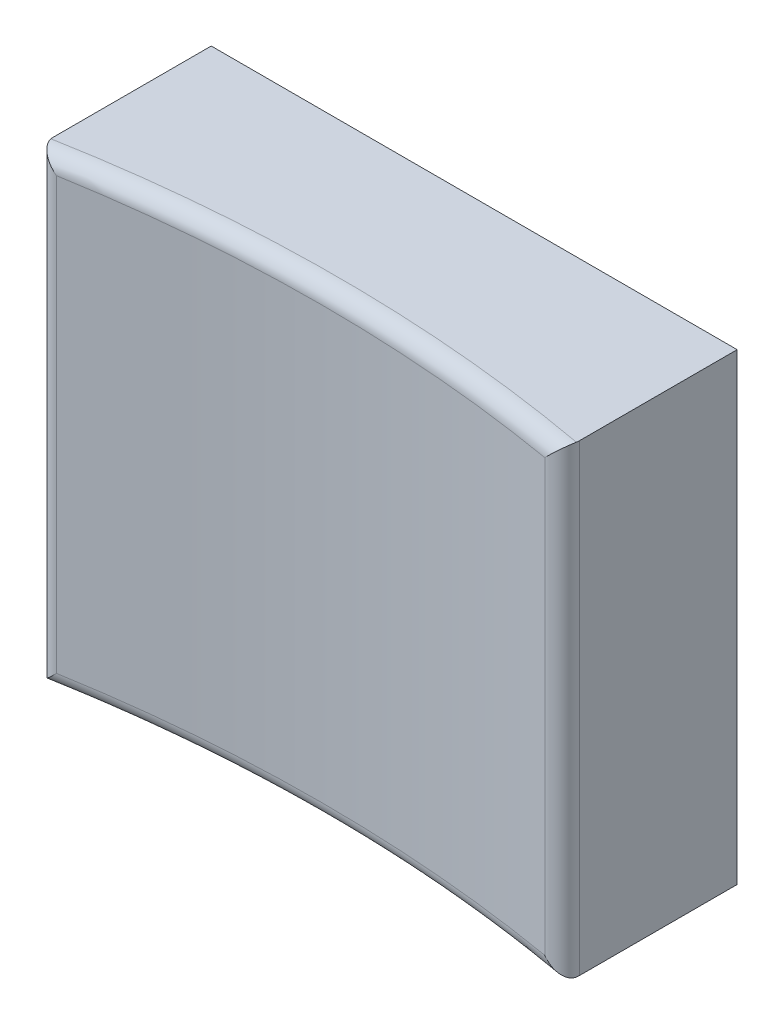
ISO-10303-21;
HEADER;
FILE_DESCRIPTION(('STEP AP214'),'2;1');
FILE_NAME('part.step','',(''),(''),'','','');
FILE_SCHEMA(('AUTOMOTIVE_DESIGN { 1 0 10303 214 1 1 1 1 }'));
ENDSEC;
DATA;
#1=APPLICATION_CONTEXT('core data for automotive mechanical design processes');
#2=APPLICATION_PROTOCOL_DEFINITION('international standard','automotive_design',2000,#1);
#3=PRODUCT_CONTEXT('',#1,'mechanical');
#4=PRODUCT('Part','Part','',(#3));
#5=PRODUCT_RELATED_PRODUCT_CATEGORY('part','',(#4));
#6=PRODUCT_DEFINITION_FORMATION('','',#4);
#7=PRODUCT_DEFINITION_CONTEXT('part definition',#1,'design');
#8=PRODUCT_DEFINITION('design','',#6,#7);
#9=PRODUCT_DEFINITION_SHAPE('','',#8);
#10=(LENGTH_UNIT() NAMED_UNIT(*) SI_UNIT(.MILLI.,.METRE.));
#11=(NAMED_UNIT(*) PLANE_ANGLE_UNIT() SI_UNIT($,.RADIAN.));
#12=(NAMED_UNIT(*) SI_UNIT($,.STERADIAN.) SOLID_ANGLE_UNIT());
#13=UNCERTAINTY_MEASURE_WITH_UNIT(LENGTH_MEASURE(1.E-05),#10,'distance_accuracy_value','');
#14=(GEOMETRIC_REPRESENTATION_CONTEXT(3) GLOBAL_UNCERTAINTY_ASSIGNED_CONTEXT((#13)) GLOBAL_UNIT_ASSIGNED_CONTEXT((#10,
#11,#12)) REPRESENTATION_CONTEXT('',''));
#15=CARTESIAN_POINT('',(0.,0.,0.));
#16=DIRECTION('',(0.,0.,1.));
#17=DIRECTION('',(1.,0.,0.));
#18=AXIS2_PLACEMENT_3D('',#15,#16,#17);
#19=CARTESIAN_POINT('',(-4.1529,3.6576,2.794));
#20=DIRECTION('',(1.,0.,0.));
#21=DIRECTION('',(0.,0.,-1.));
#22=AXIS2_PLACEMENT_3D('',#19,#20,#21);
#23=PLANE('',#22);
#24=DIRECTION('',(0.,0.,-1.));
#25=VECTOR('',#24,1.);
#26=CARTESIAN_POINT('',(-4.1529,-3.6576,2.794));
#27=LINE('',#26,#25);
#28=CARTESIAN_POINT('',(-4.1529,-3.6576,2.49082226780297));
#29=VERTEX_POINT('',#28);
#30=CARTESIAN_POINT('',(-4.1529,-3.6576,0.));
#31=VERTEX_POINT('',#30);
#32=EDGE_CURVE('E101',#29,#31,#27,.T.);
#33=ORIENTED_EDGE('',*,*,#32,.F.);
#34=DIRECTION('',(0.,-1.,0.));
#35=VECTOR('',#34,1.);
#36=CARTESIAN_POINT('',(-4.1529,3.6576,2.49082226780297));
#37=LINE('',#36,#35);
#38=CARTESIAN_POINT('',(-4.1529,3.6576,2.49082226780297));
#39=VERTEX_POINT('',#38);
#40=EDGE_CURVE('E11',#29,#39,#37,.F.);
#41=ORIENTED_EDGE('',*,*,#40,.T.);
#42=DIRECTION('',(0.,0.,-1.));
#43=VECTOR('',#42,1.);
#44=CARTESIAN_POINT('',(-4.1529,3.6576,2.794));
#45=LINE('',#44,#43);
#46=CARTESIAN_POINT('',(-4.1529,3.6576,0.));
#47=VERTEX_POINT('',#46);
#48=EDGE_CURVE('E124',#39,#47,#45,.T.);
#49=ORIENTED_EDGE('',*,*,#48,.T.);
#50=DIRECTION('',(0.,-1.,0.));
#51=VECTOR('',#50,1.);
#52=CARTESIAN_POINT('',(-4.1529,3.6576,0.));
#53=LINE('',#52,#51);
#54=EDGE_CURVE('E120',#47,#31,#53,.T.);
#55=ORIENTED_EDGE('',*,*,#54,.T.);
#56=EDGE_LOOP('',(#33,#41,#49,#55));
#57=FACE_BOUND('',#56,.T.);
#58=ADVANCED_FACE('F32',(#57),#23,.F.);
#59=CARTESIAN_POINT('',(-4.1529,-3.6576,2.794));
#60=DIRECTION('',(0.,1.,0.));
#61=DIRECTION('',(0.,0.,1.));
#62=AXIS2_PLACEMENT_3D('',#59,#60,#61);
#63=PLANE('',#62);
#64=DIRECTION('',(0.,0.,-1.));
#65=VECTOR('',#64,1.);
#66=CARTESIAN_POINT('',(4.1529,-3.6576,2.794));
#67=LINE('',#66,#65);
#68=CARTESIAN_POINT('',(4.1529,-3.6576,2.49082226780297));
#69=VERTEX_POINT('',#68);
#70=CARTESIAN_POINT('',(4.1529,-3.6576,0.));
#71=VERTEX_POINT('',#70);
#72=EDGE_CURVE('E114',#69,#71,#67,.T.);
#73=ORIENTED_EDGE('',*,*,#72,.F.);
#74=CARTESIAN_POINT('',(3.8989,-3.6576,2.49082226780297));
#75=DIRECTION('',(0.,1.,0.));
#76=DIRECTION('',(0.,0.,1.));
#77=AXIS2_PLACEMENT_3D('',#74,#75,#76);
#78=CIRCLE('',#77,0.254);
#79=CARTESIAN_POINT('',(4.14902115128335,-3.6576,2.53504228228519));
#80=VERTEX_POINT('',#79);
#81=EDGE_CURVE('E148',#69,#80,#78,.F.);
#82=ORIENTED_EDGE('',*,*,#81,.T.);
#83=CARTESIAN_POINT('',(0.,-3.6576,25.2736134662053));
#84=DIRECTION('',(0.,1.,0.));
#85=DIRECTION('',(0.,0.,1.));
#86=AXIS2_PLACEMENT_3D('',#83,#84,#85);
#87=CIRCLE('',#86,23.114);
#88=CARTESIAN_POINT('',(-4.14902115128334,-3.6576,2.53504228228519));
#89=VERTEX_POINT('',#88);
#90=EDGE_CURVE('E146',#80,#89,#87,.T.);
#91=ORIENTED_EDGE('',*,*,#90,.T.);
#92=CARTESIAN_POINT('',(-3.8989,-3.6576,2.49082226780297));
#93=DIRECTION('',(0.,1.,0.));
#94=DIRECTION('',(0.,0.,1.));
#95=AXIS2_PLACEMENT_3D('',#92,#93,#94);
#96=CIRCLE('',#95,0.254);
#97=EDGE_CURVE('E109',#89,#29,#96,.F.);
#98=ORIENTED_EDGE('',*,*,#97,.T.);
#99=ORIENTED_EDGE('',*,*,#32,.T.);
#100=DIRECTION('',(1.,0.,0.));
#101=VECTOR('',#100,1.);
#102=CARTESIAN_POINT('',(-4.1529,-3.6576,0.));
#103=LINE('',#102,#101);
#104=EDGE_CURVE('E105',#31,#71,#103,.T.);
#105=ORIENTED_EDGE('',*,*,#104,.T.);
#106=EDGE_LOOP('',(#73,#82,#91,#98,#99,#105));
#107=FACE_BOUND('',#106,.T.);
#108=ADVANCED_FACE('F104',(#107),#63,.F.);
#109=CARTESIAN_POINT('',(4.1529,3.6576,2.794));
#110=DIRECTION('',(-1.,0.,0.));
#111=DIRECTION('',(0.,0.,1.));
#112=AXIS2_PLACEMENT_3D('',#109,#110,#111);
#113=PLANE('',#112);
#114=DIRECTION('',(0.,0.,-1.));
#115=VECTOR('',#114,1.);
#116=CARTESIAN_POINT('',(4.1529,3.6576,2.794));
#117=LINE('',#116,#115);
#118=CARTESIAN_POINT('',(4.1529,3.6576,2.49082226780297));
#119=VERTEX_POINT('',#118);
#120=CARTESIAN_POINT('',(4.1529,3.6576,0.));
#121=VERTEX_POINT('',#120);
#122=EDGE_CURVE('E134',#119,#121,#117,.T.);
#123=ORIENTED_EDGE('',*,*,#122,.F.);
#124=DIRECTION('',(0.,-1.,0.));
#125=VECTOR('',#124,1.);
#126=CARTESIAN_POINT('',(4.1529,3.6576,2.49082226780297));
#127=LINE('',#126,#125);
#128=EDGE_CURVE('E45',#119,#69,#127,.T.);
#129=ORIENTED_EDGE('',*,*,#128,.T.);
#130=ORIENTED_EDGE('',*,*,#72,.T.);
#131=DIRECTION('',(0.,1.,0.));
#132=VECTOR('',#131,1.);
#133=CARTESIAN_POINT('',(4.1529,3.6576,0.));
#134=LINE('',#133,#132);
#135=EDGE_CURVE('E122',#71,#121,#134,.T.);
#136=ORIENTED_EDGE('',*,*,#135,.T.);
#137=EDGE_LOOP('',(#123,#129,#130,#136));
#138=FACE_BOUND('',#137,.T.);
#139=ADVANCED_FACE('F199',(#138),#113,.F.);
#140=CARTESIAN_POINT('',(-4.1529,3.6576,2.794));
#141=DIRECTION('',(0.,-1.,0.));
#142=DIRECTION('',(0.,0.,-1.));
#143=AXIS2_PLACEMENT_3D('',#140,#141,#142);
#144=PLANE('',#143);
#145=CARTESIAN_POINT('',(0.,3.6576,25.2736134662053));
#146=DIRECTION('',(0.,-1.,0.));
#147=DIRECTION('',(0.,0.,-1.));
#148=AXIS2_PLACEMENT_3D('',#145,#146,#147);
#149=CIRCLE('',#148,23.114);
#150=CARTESIAN_POINT('',(-4.14902115128334,3.6576,2.53504228228519));
#151=VERTEX_POINT('',#150);
#152=CARTESIAN_POINT('',(4.14902115128335,3.6576,2.53504228228519));
#153=VERTEX_POINT('',#152);
#154=EDGE_CURVE('E53',#151,#153,#149,.T.);
#155=ORIENTED_EDGE('',*,*,#154,.T.);
#156=CARTESIAN_POINT('',(3.8989,3.6576,2.49082226780297));
#157=DIRECTION('',(0.,-1.,0.));
#158=DIRECTION('',(0.,0.,-1.));
#159=AXIS2_PLACEMENT_3D('',#156,#157,#158);
#160=CIRCLE('',#159,0.254);
#161=EDGE_CURVE('E152',#153,#119,#160,.F.);
#162=ORIENTED_EDGE('',*,*,#161,.T.);
#163=ORIENTED_EDGE('',*,*,#122,.T.);
#164=DIRECTION('',(-1.,0.,0.));
#165=VECTOR('',#164,1.);
#166=CARTESIAN_POINT('',(-4.1529,3.6576,0.));
#167=LINE('',#166,#165);
#168=EDGE_CURVE('E131',#121,#47,#167,.T.);
#169=ORIENTED_EDGE('',*,*,#168,.T.);
#170=ORIENTED_EDGE('',*,*,#48,.F.);
#171=CARTESIAN_POINT('',(-3.8989,3.6576,2.49082226780297));
#172=DIRECTION('',(0.,-1.,0.));
#173=DIRECTION('',(0.,0.,-1.));
#174=AXIS2_PLACEMENT_3D('',#171,#172,#173);
#175=CIRCLE('',#174,0.254);
#176=EDGE_CURVE('E58',#39,#151,#175,.F.);
#177=ORIENTED_EDGE('',*,*,#176,.T.);
#178=EDGE_LOOP('',(#155,#162,#163,#169,#170,#177));
#179=FACE_BOUND('',#178,.T.);
#180=ADVANCED_FACE('F197',(#179),#144,.F.);
#181=CARTESIAN_POINT('',(-4.1529,-3.6576,0.));
#182=DIRECTION('',(0.,0.,1.));
#183=DIRECTION('',(1.,0.,0.));
#184=AXIS2_PLACEMENT_3D('',#181,#182,#183);
#185=PLANE('',#184);
#186=ORIENTED_EDGE('',*,*,#54,.F.);
#187=ORIENTED_EDGE('',*,*,#168,.F.);
#188=ORIENTED_EDGE('',*,*,#135,.F.);
#189=ORIENTED_EDGE('',*,*,#104,.F.);
#190=EDGE_LOOP('',(#186,#187,#188,#189));
#191=FACE_BOUND('',#190,.T.);
#192=ADVANCED_FACE('F118',(#191),#185,.F.);
#193=CARTESIAN_POINT('',(0.,3.6576,25.2736134662053));
#194=DIRECTION('',(0.,-1.,0.));
#195=DIRECTION('',(0.,0.,-1.));
#196=AXIS2_PLACEMENT_3D('',#193,#194,#195);
#197=CYLINDRICAL_SURFACE('',#196,22.86);
#198=DIRECTION('',(0.,-1.,0.));
#199=VECTOR('',#198,1.);
#200=CARTESIAN_POINT('',(-3.85605494505495,3.6576,2.74118261064256));
#201=LINE('',#200,#199);
#202=CARTESIAN_POINT('',(-3.85605494505494,3.4036,2.74118261064256));
#203=VERTEX_POINT('',#202);
#204=CARTESIAN_POINT('',(-3.85605494505494,-3.4036,2.74118261064256));
#205=VERTEX_POINT('',#204);
#206=EDGE_CURVE('E113',#203,#205,#201,.T.);
#207=ORIENTED_EDGE('',*,*,#206,.T.);
#208=CARTESIAN_POINT('',(0.,-3.4036,25.2736134662053));
#209=DIRECTION('',(0.,1.,0.));
#210=DIRECTION('',(0.,0.,1.));
#211=AXIS2_PLACEMENT_3D('',#208,#209,#210);
#212=CIRCLE('',#211,22.86);
#213=CARTESIAN_POINT('',(3.85605494505495,-3.4036,2.74118261064256));
#214=VERTEX_POINT('',#213);
#215=EDGE_CURVE('E142',#205,#214,#212,.F.);
#216=ORIENTED_EDGE('',*,*,#215,.T.);
#217=DIRECTION('',(0.,-1.,0.));
#218=VECTOR('',#217,1.);
#219=CARTESIAN_POINT('',(3.85605494505495,3.6576,2.74118261064256));
#220=LINE('',#219,#218);
#221=CARTESIAN_POINT('',(3.85605494505494,3.4036,2.74118261064256));
#222=VERTEX_POINT('',#221);
#223=EDGE_CURVE('E140',#214,#222,#220,.F.);
#224=ORIENTED_EDGE('',*,*,#223,.T.);
#225=CARTESIAN_POINT('',(0.,3.4036,25.2736134662053));
#226=DIRECTION('',(0.,-1.,0.));
#227=DIRECTION('',(0.,0.,-1.));
#228=AXIS2_PLACEMENT_3D('',#225,#226,#227);
#229=CIRCLE('',#228,22.86);
#230=EDGE_CURVE('E138',#222,#203,#229,.F.);
#231=ORIENTED_EDGE('',*,*,#230,.T.);
#232=EDGE_LOOP('',(#207,#216,#224,#231));
#233=FACE_BOUND('',#232,.T.);
#234=ADVANCED_FACE('F193',(#233),#197,.F.);
#235=CARTESIAN_POINT('',(0.,3.4036,25.2736134662053));
#236=DIRECTION('',(0.,-1.,0.));
#237=DIRECTION('',(0.,0.,-1.));
#238=AXIS2_PLACEMENT_3D('',#235,#236,#237);
#239=TOROIDAL_SURFACE('',#238,23.114,0.254);
#240=CARTESIAN_POINT('',(4.14902115128334,3.6576,2.53504228228519));
#241=CARTESIAN_POINT('',(4.147057413291,3.65761941798704,2.54626051410528));
#242=CARTESIAN_POINT('',(4.14430772511394,3.6568354333532,2.55731081895926));
#243=CARTESIAN_POINT('',(4.13747618648574,3.65382566993983,2.57868277036022));
#244=CARTESIAN_POINT('',(4.13340609550221,3.65161245353686,2.58900990487564));
#245=CARTESIAN_POINT('',(4.12414457602549,3.64591191486797,2.60872099226871));
#246=CARTESIAN_POINT('',(4.11895619634246,3.64242803929229,2.61810740987538));
#247=CARTESIAN_POINT('',(4.10768989632173,3.63439821947881,2.63585133698443));
#248=CARTESIAN_POINT('',(4.10160999846191,3.6298499004188,2.64420648105353));
#249=CARTESIAN_POINT('',(4.08616781818806,3.61787034509634,2.66301192454394));
#250=CARTESIAN_POINT('',(4.07647841036786,3.61002001166474,2.67292620715351));
#251=CARTESIAN_POINT('',(4.05626652321987,3.59311999450385,2.69065535724881));
#252=CARTESIAN_POINT('',(4.04574245787371,3.58406800428347,2.69846609755017));
#253=CARTESIAN_POINT('',(4.01998736240649,3.56142212858062,2.71480621902723));
#254=CARTESIAN_POINT('',(4.00452436143891,3.5474358957305,2.72242320526477));
#255=CARTESIAN_POINT('',(3.9732291866513,3.51849989343228,2.73427998095239));
#256=CARTESIAN_POINT('',(3.95739661035331,3.50354903893871,2.73851589304369));
#257=CARTESIAN_POINT('',(3.92754170272988,3.4748495058296,2.74360271280981));
#258=CARTESIAN_POINT('',(3.91351825281961,3.46115745374889,2.74478377230257));
#259=CARTESIAN_POINT('',(3.88568860791458,3.43359421272603,2.7448588164792));
#260=CARTESIAN_POINT('',(3.87188203426182,3.41972343717708,2.74375737401577));
#261=CARTESIAN_POINT('',(3.85753243966568,3.40510670739394,2.74143209205596));
#262=CARTESIAN_POINT('',(3.8567933938316,3.40435333384913,2.74130897875889));
#263=CARTESIAN_POINT('',(3.85605494505495,3.4036,2.74118261064256));
#264=B_SPLINE_CURVE_WITH_KNOTS('',3,(#240,#241,#242,#243,#244,#245,#246,#247,#248,#249,#250,
#251,#252,#253,#254,#255,#256,#257,#258,#259,#260,#261,#262,#263),.UNSPECIFIED.,.F.,.F.,(4,2,2,
2,2,2,2,2,2,2,2,4),(0.,0.0340672177638823,0.0678390004190167,0.101519849519903,
0.135276570813308,0.182806102249537,0.230428219033018,0.296664129326276,0.362975889149356,
0.421746978486034,0.480400437389645,0.483587928393868),.UNSPECIFIED.);
#265=EDGE_CURVE('E128',#153,#222,#264,.T.);
#266=ORIENTED_EDGE('',*,*,#265,.F.);
#267=ORIENTED_EDGE('',*,*,#154,.F.);
#268=CARTESIAN_POINT('',(-4.14902115128334,3.6576,2.53504228228519));
#269=CARTESIAN_POINT('',(-4.147057413291,3.65761941798704,2.54626051410528));
#270=CARTESIAN_POINT('',(-4.14430772511394,3.6568354333532,2.55731081895926));
#271=CARTESIAN_POINT('',(-4.13747618648574,3.65382566993983,2.57868277036022));
#272=CARTESIAN_POINT('',(-4.13340609550221,3.65161245353686,2.58900990487564));
#273=CARTESIAN_POINT('',(-4.12414457602549,3.64591191486797,2.60872099226871));
#274=CARTESIAN_POINT('',(-4.11895619634246,3.64242803929229,2.61810740987538));
#275=CARTESIAN_POINT('',(-4.10768989632173,3.63439821947881,2.63585133698443));
#276=CARTESIAN_POINT('',(-4.10160999846191,3.6298499004188,2.64420648105353));
#277=CARTESIAN_POINT('',(-4.08616781818806,3.61787034509634,2.66301192454394));
#278=CARTESIAN_POINT('',(-4.07647841036786,3.61002001166474,2.67292620715351));
#279=CARTESIAN_POINT('',(-4.05626652321987,3.59311999450385,2.69065535724881));
#280=CARTESIAN_POINT('',(-4.04574245787371,3.58406800428347,2.69846609755017));
#281=CARTESIAN_POINT('',(-4.01998736240649,3.56142212858062,2.71480621902723));
#282=CARTESIAN_POINT('',(-4.00452436143891,3.5474358957305,2.72242320526477));
#283=CARTESIAN_POINT('',(-3.9732291866513,3.51849989343228,2.73427998095239));
#284=CARTESIAN_POINT('',(-3.95739661035331,3.50354903893871,2.73851589304369));
#285=CARTESIAN_POINT('',(-3.92754170272988,3.4748495058296,2.74360271280981));
#286=CARTESIAN_POINT('',(-3.91351825281961,3.46115745374889,2.74478377230257));
#287=CARTESIAN_POINT('',(-3.88568860791458,3.43359421272603,2.7448588164792));
#288=CARTESIAN_POINT('',(-3.87188203426182,3.41972343717708,2.74375737401577));
#289=CARTESIAN_POINT('',(-3.85753243966568,3.40510670739394,2.74143209205596));
#290=CARTESIAN_POINT('',(-3.8567933938316,3.40435333384913,2.74130897875889));
#291=CARTESIAN_POINT('',(-3.85605494505495,3.4036,2.74118261064256));
#292=B_SPLINE_CURVE_WITH_KNOTS('',3,(#268,#269,#270,#271,#272,#273,#274,#275,#276,#277,#278,
#279,#280,#281,#282,#283,#284,#285,#286,#287,#288,#289,#290,#291),.UNSPECIFIED.,.F.,.F.,(4,2,2,
2,2,2,2,2,2,2,2,4),(0.,0.0340672177638823,0.0678390004190167,0.101519849519903,
0.135276570813308,0.182806102249537,0.230428219033018,0.296664129326276,0.362975889149356,
0.421746978486034,0.480400437389645,0.483587928393868),.UNSPECIFIED.);
#293=EDGE_CURVE('E37',#203,#151,#292,.F.);
#294=ORIENTED_EDGE('',*,*,#293,.F.);
#295=ORIENTED_EDGE('',*,*,#230,.F.);
#296=EDGE_LOOP('',(#266,#267,#294,#295));
#297=FACE_BOUND('',#296,.T.);
#298=ADVANCED_FACE('F34',(#297),#239,.T.);
#299=CARTESIAN_POINT('',(-3.8989,3.6576,2.49082226780297));
#300=DIRECTION('',(0.,-1.,0.));
#301=DIRECTION('',(0.,0.,-1.));
#302=AXIS2_PLACEMENT_3D('',#299,#300,#301);
#303=CYLINDRICAL_SURFACE('',#302,0.254);
#304=ORIENTED_EDGE('',*,*,#40,.F.);
#305=ORIENTED_EDGE('',*,*,#97,.F.);
#306=CARTESIAN_POINT('',(-4.14902115128334,-3.6576,2.53504228228519));
#307=CARTESIAN_POINT('',(-4.147057413291,-3.65761941798704,2.54626051410528));
#308=CARTESIAN_POINT('',(-4.14430772511394,-3.6568354333532,2.55731081895926));
#309=CARTESIAN_POINT('',(-4.13747618648574,-3.65382566993983,2.57868277036022));
#310=CARTESIAN_POINT('',(-4.13340609550221,-3.65161245353686,2.58900990487564));
#311=CARTESIAN_POINT('',(-4.12414457602549,-3.64591191486797,2.60872099226871));
#312=CARTESIAN_POINT('',(-4.11895619634246,-3.64242803929229,2.61810740987538));
#313=CARTESIAN_POINT('',(-4.10768989632173,-3.63439821947881,2.63585133698443));
#314=CARTESIAN_POINT('',(-4.10160999846191,-3.6298499004188,2.64420648105353));
#315=CARTESIAN_POINT('',(-4.08616781818806,-3.61787034509634,2.66301192454394));
#316=CARTESIAN_POINT('',(-4.07647841036786,-3.61002001166474,2.67292620715351));
#317=CARTESIAN_POINT('',(-4.05626652321987,-3.59311999450385,2.69065535724881));
#318=CARTESIAN_POINT('',(-4.04574245787371,-3.58406800428347,2.69846609755017));
#319=CARTESIAN_POINT('',(-4.01998736240649,-3.56142212858062,2.71480621902723));
#320=CARTESIAN_POINT('',(-4.00452436143891,-3.5474358957305,2.72242320526477));
#321=CARTESIAN_POINT('',(-3.9732291866513,-3.51849989343228,2.73427998095239));
#322=CARTESIAN_POINT('',(-3.95739661035331,-3.50354903893871,2.73851589304369));
#323=CARTESIAN_POINT('',(-3.92754170272988,-3.4748495058296,2.74360271280981));
#324=CARTESIAN_POINT('',(-3.91351825281961,-3.46115745374889,2.74478377230257));
#325=CARTESIAN_POINT('',(-3.88568860791458,-3.43359421272603,2.7448588164792));
#326=CARTESIAN_POINT('',(-3.87188203426182,-3.41972343717708,2.74375737401577));
#327=CARTESIAN_POINT('',(-3.85753243966568,-3.40510670739394,2.74143209205596));
#328=CARTESIAN_POINT('',(-3.8567933938316,-3.40435333384913,2.74130897875889));
#329=CARTESIAN_POINT('',(-3.85605494505495,-3.4036,2.74118261064256));
#330=B_SPLINE_CURVE_WITH_KNOTS('',3,(#306,#307,#308,#309,#310,#311,#312,#313,#314,#315,#316,
#317,#318,#319,#320,#321,#322,#323,#324,#325,#326,#327,#328,#329),.UNSPECIFIED.,.F.,.F.,(4,2,2,
2,2,2,2,2,2,2,2,4),(0.,0.0340672177638823,0.0678390004190167,0.101519849519903,
0.135276570813308,0.182806102249537,0.230428219033018,0.296664129326276,0.362975889149356,
0.421746978486034,0.480400437389645,0.483587928393868),.UNSPECIFIED.);
#331=EDGE_CURVE('E162',#205,#89,#330,.F.);
#332=ORIENTED_EDGE('',*,*,#331,.F.);
#333=ORIENTED_EDGE('',*,*,#206,.F.);
#334=ORIENTED_EDGE('',*,*,#293,.T.);
#335=ORIENTED_EDGE('',*,*,#176,.F.);
#336=EDGE_LOOP('',(#304,#305,#332,#333,#334,#335));
#337=FACE_BOUND('',#336,.T.);
#338=ADVANCED_FACE('F172',(#337),#303,.T.);
#339=CARTESIAN_POINT('',(3.8989,3.6576,2.49082226780297));
#340=DIRECTION('',(0.,-1.,0.));
#341=DIRECTION('',(0.,0.,-1.));
#342=AXIS2_PLACEMENT_3D('',#339,#340,#341);
#343=CYLINDRICAL_SURFACE('',#342,0.254);
#344=ORIENTED_EDGE('',*,*,#265,.T.);
#345=ORIENTED_EDGE('',*,*,#223,.F.);
#346=CARTESIAN_POINT('',(4.14902115128334,-3.6576,2.53504228228519));
#347=CARTESIAN_POINT('',(4.147057413291,-3.65761941798704,2.54626051410528));
#348=CARTESIAN_POINT('',(4.14430772511394,-3.6568354333532,2.55731081895926));
#349=CARTESIAN_POINT('',(4.13747618648574,-3.65382566993983,2.57868277036022));
#350=CARTESIAN_POINT('',(4.13340609550221,-3.65161245353686,2.58900990487564));
#351=CARTESIAN_POINT('',(4.12414457602549,-3.64591191486797,2.60872099226871));
#352=CARTESIAN_POINT('',(4.11895619634246,-3.64242803929229,2.61810740987538));
#353=CARTESIAN_POINT('',(4.10768989632173,-3.63439821947881,2.63585133698443));
#354=CARTESIAN_POINT('',(4.10160999846191,-3.6298499004188,2.64420648105353));
#355=CARTESIAN_POINT('',(4.08616781818806,-3.61787034509634,2.66301192454394));
#356=CARTESIAN_POINT('',(4.07647841036786,-3.61002001166474,2.67292620715351));
#357=CARTESIAN_POINT('',(4.05626652321987,-3.59311999450385,2.69065535724881));
#358=CARTESIAN_POINT('',(4.04574245787371,-3.58406800428347,2.69846609755017));
#359=CARTESIAN_POINT('',(4.01998736240649,-3.56142212858062,2.71480621902723));
#360=CARTESIAN_POINT('',(4.00452436143892,-3.54743589573049,2.72242320526477));
#361=CARTESIAN_POINT('',(3.9732291866513,-3.51849989343228,2.73427998095239));
#362=CARTESIAN_POINT('',(3.9573966103533,-3.50354903893872,2.73851589304369));
#363=CARTESIAN_POINT('',(3.92754170272989,-3.47484950582959,2.74360271280981));
#364=CARTESIAN_POINT('',(3.91351825281964,-3.46115745374887,2.74478377230257));
#365=CARTESIAN_POINT('',(3.88568860791457,-3.43359421272604,2.7448588164792));
#366=CARTESIAN_POINT('',(3.87188203426175,-3.41972343717715,2.74375737401576));
#367=CARTESIAN_POINT('',(3.85753243966567,-3.40510670739395,2.74143209205596));
#368=CARTESIAN_POINT('',(3.85679339383159,-3.40435333384913,2.74130897875889));
#369=CARTESIAN_POINT('',(3.85605494505495,-3.4036,2.74118261064256));
#370=B_SPLINE_CURVE_WITH_KNOTS('',3,(#346,#347,#348,#349,#350,#351,#352,#353,#354,#355,#356,
#357,#358,#359,#360,#361,#362,#363,#364,#365,#366,#367,#368,#369),.UNSPECIFIED.,.F.,.F.,(4,2,2,
2,2,2,2,2,2,2,2,4),(0.,0.0340672177638827,0.0678390004190167,0.101519849519903,
0.135276570813308,0.182806102249536,0.230428219033018,0.296664129326277,0.362975889149356,
0.421746978486034,0.480400437389645,0.483587928393868),.UNSPECIFIED.);
#371=EDGE_CURVE('E155',#80,#214,#370,.T.);
#372=ORIENTED_EDGE('',*,*,#371,.F.);
#373=ORIENTED_EDGE('',*,*,#81,.F.);
#374=ORIENTED_EDGE('',*,*,#128,.F.);
#375=ORIENTED_EDGE('',*,*,#161,.F.);
#376=EDGE_LOOP('',(#344,#345,#372,#373,#374,#375));
#377=FACE_BOUND('',#376,.T.);
#378=ADVANCED_FACE('F169',(#377),#343,.T.);
#379=CARTESIAN_POINT('',(0.,-3.4036,25.2736134662053));
#380=DIRECTION('',(0.,1.,0.));
#381=DIRECTION('',(0.,0.,1.));
#382=AXIS2_PLACEMENT_3D('',#379,#380,#381);
#383=TOROIDAL_SURFACE('',#382,23.114,0.254);
#384=ORIENTED_EDGE('',*,*,#331,.T.);
#385=ORIENTED_EDGE('',*,*,#90,.F.);
#386=ORIENTED_EDGE('',*,*,#371,.T.);
#387=ORIENTED_EDGE('',*,*,#215,.F.);
#388=EDGE_LOOP('',(#384,#385,#386,#387));
#389=FACE_BOUND('',#388,.T.);
#390=ADVANCED_FACE('F166',(#389),#383,.T.);
#391=CLOSED_SHELL('',(#58,#108,#139,#180,#192,#234,#298,#338,#378,#390));
#392=MANIFOLD_SOLID_BREP('B2',#391);
#393=ADVANCED_BREP_SHAPE_REPRESENTATION('',(#18,#392),#14);
#394=SHAPE_DEFINITION_REPRESENTATION(#9,#393);
ENDSEC;
END-ISO-10303-21;
